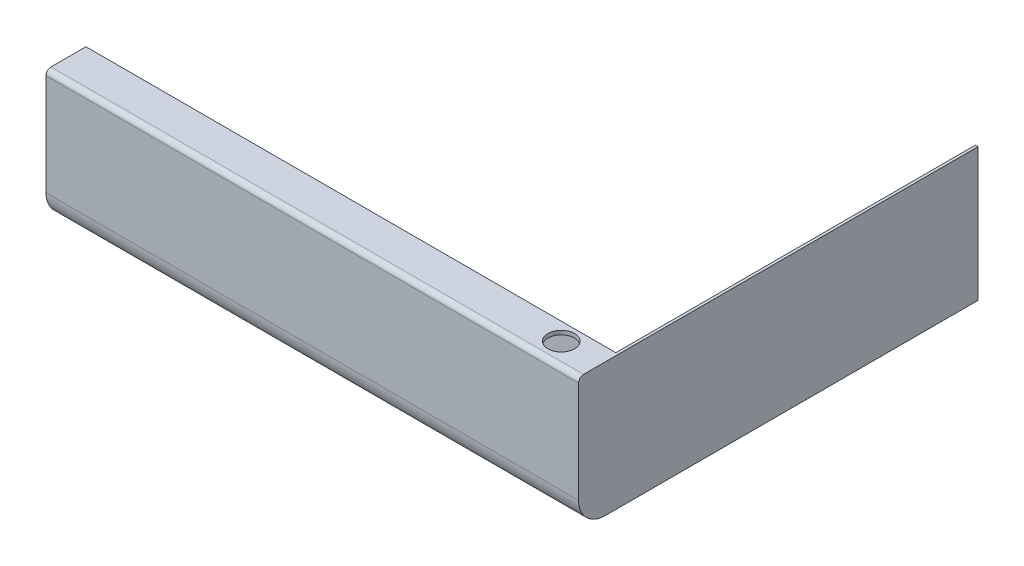
ISO-10303-21;
HEADER;
FILE_DESCRIPTION(('STEP AP214'),'2;1');
FILE_NAME('part.step','',(''),(''),'','','');
FILE_SCHEMA(('AUTOMOTIVE_DESIGN { 1 0 10303 214 1 1 1 1 }'));
ENDSEC;
DATA;
#1=APPLICATION_CONTEXT('core data for automotive mechanical design processes');
#2=APPLICATION_PROTOCOL_DEFINITION('international standard','automotive_design',2000,#1);
#3=PRODUCT_CONTEXT('',#1,'mechanical');
#4=PRODUCT('Part','Part','',(#3));
#5=PRODUCT_RELATED_PRODUCT_CATEGORY('part','',(#4));
#6=PRODUCT_DEFINITION_FORMATION('','',#4);
#7=PRODUCT_DEFINITION_CONTEXT('part definition',#1,'design');
#8=PRODUCT_DEFINITION('design','',#6,#7);
#9=PRODUCT_DEFINITION_SHAPE('','',#8);
#10=(LENGTH_UNIT() NAMED_UNIT(*) SI_UNIT(.MILLI.,.METRE.));
#11=(NAMED_UNIT(*) PLANE_ANGLE_UNIT() SI_UNIT($,.RADIAN.));
#12=(NAMED_UNIT(*) SI_UNIT($,.STERADIAN.) SOLID_ANGLE_UNIT());
#13=UNCERTAINTY_MEASURE_WITH_UNIT(LENGTH_MEASURE(1.E-05),#10,'distance_accuracy_value','');
#14=(GEOMETRIC_REPRESENTATION_CONTEXT(3) GLOBAL_UNCERTAINTY_ASSIGNED_CONTEXT((#13)) GLOBAL_UNIT_ASSIGNED_CONTEXT((#10,
#11,#12)) REPRESENTATION_CONTEXT('',''));
#15=CARTESIAN_POINT('',(0.,0.,0.));
#16=DIRECTION('',(0.,0.,1.));
#17=DIRECTION('',(1.,0.,0.));
#18=AXIS2_PLACEMENT_3D('',#15,#16,#17);
#19=CARTESIAN_POINT('',(0.,-47.,-5.99999999999983));
#20=DIRECTION('',(0.,-1.,0.));
#21=DIRECTION('',(0.,0.,1.));
#22=AXIS2_PLACEMENT_3D('',#19,#20,#21);
#23=PLANE('',#22);
#24=DIRECTION('',(0.,0.,-1.));
#25=VECTOR('',#24,1.);
#26=CARTESIAN_POINT('',(198.,-47.,-5.99999999999983));
#27=LINE('',#26,#25);
#28=CARTESIAN_POINT('',(198.,-47.0000000000001,-22.9999999999999));
#29=VERTEX_POINT('',#28);
#30=CARTESIAN_POINT('',(198.,-47.0000000000003,-99.2633999999996));
#31=VERTEX_POINT('',#30);
#32=EDGE_CURVE('E228',#29,#31,#27,.T.);
#33=ORIENTED_EDGE('',*,*,#32,.T.);
#34=DIRECTION('',(1.,0.,0.));
#35=VECTOR('',#34,1.);
#36=CARTESIAN_POINT('',(200.,-47.0000000000003,-99.2633999999996));
#37=LINE('',#36,#35);
#38=CARTESIAN_POINT('',(-198.,-47.0000000000003,-99.2633999999996));
#39=VERTEX_POINT('',#38);
#40=EDGE_CURVE('E284',#31,#39,#37,.F.);
#41=ORIENTED_EDGE('',*,*,#40,.T.);
#42=DIRECTION('',(0.,0.,1.));
#43=VECTOR('',#42,1.);
#44=CARTESIAN_POINT('',(-198.,-47.,-5.99999999999983));
#45=LINE('',#44,#43);
#46=CARTESIAN_POINT('',(-198.,-47.0000000000001,-22.9999999999999));
#47=VERTEX_POINT('',#46);
#48=EDGE_CURVE('E260',#39,#47,#45,.T.);
#49=ORIENTED_EDGE('',*,*,#48,.T.);
#50=DIRECTION('',(-1.,0.,0.));
#51=VECTOR('',#50,1.);
#52=CARTESIAN_POINT('',(-200.,-47.0000000000001,-22.9999999999999));
#53=LINE('',#52,#51);
#54=EDGE_CURVE('E338',#47,#29,#53,.F.);
#55=ORIENTED_EDGE('',*,*,#54,.T.);
#56=EDGE_LOOP('',(#33,#41,#49,#55));
#57=FACE_BOUND('',#56,.T.);
#58=ADVANCED_FACE('F39',(#57),#23,.F.);
#59=CARTESIAN_POINT('',(0.,0.,-6.));
#60=DIRECTION('',(0.,0.,-1.));
#61=DIRECTION('',(1.,0.,0.));
#62=AXIS2_PLACEMENT_3D('',#59,#60,#61);
#63=PLANE('',#62);
#64=DIRECTION('',(1.,0.,0.));
#65=VECTOR('',#64,1.);
#66=CARTESIAN_POINT('',(200.,-30.0000000000001,-6.));
#67=LINE('',#66,#65);
#68=CARTESIAN_POINT('',(198.,-30.0000000000001,-6.));
#69=VERTEX_POINT('',#68);
#70=CARTESIAN_POINT('',(-198.,-30.0000000000001,-6.));
#71=VERTEX_POINT('',#70);
#72=EDGE_CURVE('E345',#69,#71,#67,.F.);
#73=ORIENTED_EDGE('',*,*,#72,.T.);
#74=DIRECTION('',(0.,-1.,0.));
#75=VECTOR('',#74,1.);
#76=CARTESIAN_POINT('',(-198.,0.,-6.));
#77=LINE('',#76,#75);
#78=CARTESIAN_POINT('',(-198.,46.2634,-6.00000000000002));
#79=VERTEX_POINT('',#78);
#80=EDGE_CURVE('E265',#79,#71,#77,.T.);
#81=ORIENTED_EDGE('',*,*,#80,.F.);
#82=DIRECTION('',(-1.,0.,0.));
#83=VECTOR('',#82,1.);
#84=CARTESIAN_POINT('',(-200.,46.2634,-6.00000000000002));
#85=LINE('',#84,#83);
#86=CARTESIAN_POINT('',(198.,46.2634,-5.99999999999999));
#87=VERTEX_POINT('',#86);
#88=EDGE_CURVE('E314',#79,#87,#85,.F.);
#89=ORIENTED_EDGE('',*,*,#88,.T.);
#90=DIRECTION('',(0.,1.,0.));
#91=VECTOR('',#90,1.);
#92=CARTESIAN_POINT('',(198.,0.,-6.));
#93=LINE('',#92,#91);
#94=EDGE_CURVE('E232',#69,#87,#93,.T.);
#95=ORIENTED_EDGE('',*,*,#94,.F.);
#96=EDGE_LOOP('',(#73,#81,#89,#95));
#97=FACE_BOUND('',#96,.T.);
#98=ADVANCED_FACE('F405',(#97),#63,.T.);
#99=CARTESIAN_POINT('',(200.,-30.0000000000001,-23.));
#100=DIRECTION('',(1.,0.,0.));
#101=DIRECTION('',(0.,-1.,0.));
#102=AXIS2_PLACEMENT_3D('',#99,#100,#101);
#103=CYLINDRICAL_SURFACE('',#102,17.);
#104=CARTESIAN_POINT('',(198.,-30.0000000000001,-23.));
#105=DIRECTION('',(-1.,0.,0.));
#106=DIRECTION('',(0.,0.,1.));
#107=AXIS2_PLACEMENT_3D('',#104,#105,#106);
#108=CIRCLE('',#107,17.);
#109=EDGE_CURVE('E54',#69,#29,#108,.F.);
#110=ORIENTED_EDGE('',*,*,#109,.T.);
#111=ORIENTED_EDGE('',*,*,#54,.F.);
#112=CARTESIAN_POINT('',(-198.,-30.0000000000001,-23.));
#113=DIRECTION('',(1.,0.,0.));
#114=DIRECTION('',(0.,0.,-1.));
#115=AXIS2_PLACEMENT_3D('',#112,#113,#114);
#116=CIRCLE('',#115,17.);
#117=EDGE_CURVE('E263',#47,#71,#116,.F.);
#118=ORIENTED_EDGE('',*,*,#117,.T.);
#119=ORIENTED_EDGE('',*,*,#72,.F.);
#120=EDGE_LOOP('',(#110,#111,#118,#119));
#121=FACE_BOUND('',#120,.T.);
#122=ADVANCED_FACE('F408',(#121),#103,.F.);
#123=CARTESIAN_POINT('',(-200.,46.2634,-6.73660000000002));
#124=DIRECTION('',(-1.,0.,0.));
#125=DIRECTION('',(0.,1.,0.));
#126=AXIS2_PLACEMENT_3D('',#123,#124,#125);
#127=CYLINDRICAL_SURFACE('',#126,0.736599999999997);
#128=CARTESIAN_POINT('',(198.,46.2634,-6.73659999999999));
#129=DIRECTION('',(-1.,0.,0.));
#130=DIRECTION('',(0.,0.,1.));
#131=AXIS2_PLACEMENT_3D('',#128,#129,#130);
#132=CIRCLE('',#131,0.736599999999997);
#133=CARTESIAN_POINT('',(198.,47.,-6.7366));
#134=VERTEX_POINT('',#133);
#135=EDGE_CURVE('E234',#134,#87,#132,.F.);
#136=ORIENTED_EDGE('',*,*,#135,.T.);
#137=ORIENTED_EDGE('',*,*,#88,.F.);
#138=CARTESIAN_POINT('',(-198.,46.2634,-6.73660000000002));
#139=DIRECTION('',(1.,0.,0.));
#140=DIRECTION('',(0.,0.,-1.));
#141=AXIS2_PLACEMENT_3D('',#138,#139,#140);
#142=CIRCLE('',#141,0.736599999999997);
#143=CARTESIAN_POINT('',(-198.,47.,-6.73660000000001));
#144=VERTEX_POINT('',#143);
#145=EDGE_CURVE('E268',#79,#144,#142,.F.);
#146=ORIENTED_EDGE('',*,*,#145,.T.);
#147=DIRECTION('',(1.,0.,0.));
#148=VECTOR('',#147,1.);
#149=CARTESIAN_POINT('',(200.,47.,-6.7366));
#150=LINE('',#149,#148);
#151=EDGE_CURVE('E309',#134,#144,#150,.F.);
#152=ORIENTED_EDGE('',*,*,#151,.F.);
#153=EDGE_LOOP('',(#136,#137,#146,#152));
#154=FACE_BOUND('',#153,.T.);
#155=ADVANCED_FACE('F402',(#154),#127,.F.);
#156=CARTESIAN_POINT('',(200.,-46.2634000000003,-99.2633999999996));
#157=DIRECTION('',(1.,0.,0.));
#158=DIRECTION('',(0.,0.,-1.));
#159=AXIS2_PLACEMENT_3D('',#156,#157,#158);
#160=CYLINDRICAL_SURFACE('',#159,0.736600000000004);
#161=CARTESIAN_POINT('',(198.,-46.2634000000003,-99.2633999999996));
#162=DIRECTION('',(-1.,0.,0.));
#163=DIRECTION('',(0.,0.,1.));
#164=AXIS2_PLACEMENT_3D('',#161,#162,#163);
#165=CIRCLE('',#164,0.736600000000004);
#166=CARTESIAN_POINT('',(198.,-46.2634000000003,-99.9999999999997));
#167=VERTEX_POINT('',#166);
#168=EDGE_CURVE('E225',#31,#167,#165,.F.);
#169=ORIENTED_EDGE('',*,*,#168,.T.);
#170=DIRECTION('',(-1.,0.,0.));
#171=VECTOR('',#170,1.);
#172=CARTESIAN_POINT('',(-200.,-46.2634000000003,-99.9999999999997));
#173=LINE('',#172,#171);
#174=CARTESIAN_POINT('',(-198.,-46.2634000000003,-99.9999999999997));
#175=VERTEX_POINT('',#174);
#176=EDGE_CURVE('E300',#175,#167,#173,.F.);
#177=ORIENTED_EDGE('',*,*,#176,.F.);
#178=CARTESIAN_POINT('',(-198.,-46.2634000000003,-99.2633999999996));
#179=DIRECTION('',(1.,0.,0.));
#180=DIRECTION('',(0.,0.,-1.));
#181=AXIS2_PLACEMENT_3D('',#178,#179,#180);
#182=CIRCLE('',#181,0.736600000000004);
#183=EDGE_CURVE('E257',#175,#39,#182,.F.);
#184=ORIENTED_EDGE('',*,*,#183,.T.);
#185=ORIENTED_EDGE('',*,*,#40,.F.);
#186=EDGE_LOOP('',(#169,#177,#184,#185));
#187=FACE_BOUND('',#186,.T.);
#188=ADVANCED_FACE('F412',(#187),#160,.F.);
#189=CARTESIAN_POINT('',(0.,47.,-5.99999999999982));
#190=DIRECTION('',(0.,1.,0.));
#191=DIRECTION('',(0.,0.,-1.));
#192=AXIS2_PLACEMENT_3D('',#189,#190,#191);
#193=PLANE('',#192);
#194=CARTESIAN_POINT('',(170.,47.,-20.));
#195=DIRECTION('',(0.,-1.,0.));
#196=DIRECTION('',(0.,0.,-1.));
#197=AXIS2_PLACEMENT_3D('',#194,#195,#196);
#198=CIRCLE('',#197,9.99999999999998);
#199=CARTESIAN_POINT('',(170.,47.0000000000001,-30.));
#200=VERTEX_POINT('',#199);
#201=EDGE_CURVE('E281',#200,#200,#198,.T.);
#202=ORIENTED_EDGE('',*,*,#201,.F.);
#203=EDGE_LOOP('',(#202));
#204=FACE_BOUND('',#203,.T.);
#205=DIRECTION('',(0.,0.,1.));
#206=VECTOR('',#205,1.);
#207=CARTESIAN_POINT('',(198.,47.,-5.99999999999982));
#208=LINE('',#207,#206);
#209=CARTESIAN_POINT('',(198.,47.0000000000001,-33.));
#210=VERTEX_POINT('',#209);
#211=EDGE_CURVE('E236',#210,#134,#208,.T.);
#212=ORIENTED_EDGE('',*,*,#211,.T.);
#213=ORIENTED_EDGE('',*,*,#151,.T.);
#214=DIRECTION('',(0.,0.,-1.));
#215=VECTOR('',#214,1.);
#216=CARTESIAN_POINT('',(-198.,47.,-5.99999999999982));
#217=LINE('',#216,#215);
#218=CARTESIAN_POINT('',(-198.,47.,-18.));
#219=VERTEX_POINT('',#218);
#220=EDGE_CURVE('E271',#144,#219,#217,.T.);
#221=ORIENTED_EDGE('',*,*,#220,.T.);
#222=DIRECTION('',(1.,0.,0.));
#223=VECTOR('',#222,1.);
#224=CARTESIAN_POINT('',(0.,47.,-18.));
#225=LINE('',#224,#223);
#226=CARTESIAN_POINT('',(-200.,47.,-18.));
#227=VERTEX_POINT('',#226);
#228=EDGE_CURVE('E47',#227,#219,#225,.T.);
#229=ORIENTED_EDGE('',*,*,#228,.F.);
#230=DIRECTION('',(0.,0.,-1.));
#231=VECTOR('',#230,1.);
#232=CARTESIAN_POINT('',(-200.,47.,-5.99999999999982));
#233=LINE('',#232,#231);
#234=CARTESIAN_POINT('',(-200.,47.0000000000001,-33.));
#235=VERTEX_POINT('',#234);
#236=EDGE_CURVE('E321',#235,#227,#233,.F.);
#237=ORIENTED_EDGE('',*,*,#236,.F.);
#238=DIRECTION('',(1.,0.,0.));
#239=VECTOR('',#238,1.);
#240=CARTESIAN_POINT('',(0.,47.0000000000001,-33.));
#241=LINE('',#240,#239);
#242=EDGE_CURVE('E324',#210,#235,#241,.F.);
#243=ORIENTED_EDGE('',*,*,#242,.F.);
#244=EDGE_LOOP('',(#212,#213,#221,#229,#237,#243));
#245=FACE_BOUND('',#244,.T.);
#246=ADVANCED_FACE('F383',(#204,#245),#193,.F.);
#247=CARTESIAN_POINT('',(-200.,50.0000000000001,-33.));
#248=DIRECTION('',(0.,0.,-1.));
#249=DIRECTION('',(0.,-1.,0.));
#250=AXIS2_PLACEMENT_3D('',#247,#248,#249);
#251=PLANE('',#250);
#252=ORIENTED_EDGE('',*,*,#242,.T.);
#253=DIRECTION('',(0.,-1.,0.));
#254=VECTOR('',#253,1.);
#255=CARTESIAN_POINT('',(-200.,50.0000000000001,-33.));
#256=LINE('',#255,#254);
#257=CARTESIAN_POINT('',(-200.,50.0000000000001,-33.));
#258=VERTEX_POINT('',#257);
#259=EDGE_CURVE('E312',#258,#235,#256,.T.);
#260=ORIENTED_EDGE('',*,*,#259,.F.);
#261=DIRECTION('',(-1.,0.,0.));
#262=VECTOR('',#261,1.);
#263=CARTESIAN_POINT('',(-200.,50.0000000000001,-33.));
#264=LINE('',#263,#262);
#265=CARTESIAN_POINT('',(198.,50.0000000000001,-33.));
#266=VERTEX_POINT('',#265);
#267=EDGE_CURVE('E318',#266,#258,#264,.T.);
#268=ORIENTED_EDGE('',*,*,#267,.F.);
#269=DIRECTION('',(0.,1.,0.));
#270=VECTOR('',#269,1.);
#271=CARTESIAN_POINT('',(198.,50.0000000000001,-33.));
#272=LINE('',#271,#270);
#273=EDGE_CURVE('E201',#210,#266,#272,.T.);
#274=ORIENTED_EDGE('',*,*,#273,.F.);
#275=EDGE_LOOP('',(#252,#260,#268,#274));
#276=FACE_BOUND('',#275,.T.);
#277=ADVANCED_FACE('F447',(#276),#251,.T.);
#278=CARTESIAN_POINT('',(200.,-46.2634000000003,-99.2633999999996));
#279=DIRECTION('',(1.,0.,0.));
#280=DIRECTION('',(0.,0.,-1.));
#281=AXIS2_PLACEMENT_3D('',#278,#279,#280);
#282=CYLINDRICAL_SURFACE('',#281,3.7366);
#283=DIRECTION('',(1.,0.,0.));
#284=VECTOR('',#283,1.);
#285=CARTESIAN_POINT('',(200.,-50.0000000000003,-99.2633999999996));
#286=LINE('',#285,#284);
#287=CARTESIAN_POINT('',(198.,-50.0000000000003,-99.2633999999996));
#288=VERTEX_POINT('',#287);
#289=CARTESIAN_POINT('',(-200.,-50.0000000000003,-99.2633999999996));
#290=VERTEX_POINT('',#289);
#291=EDGE_CURVE('E303',#288,#290,#286,.F.);
#292=ORIENTED_EDGE('',*,*,#291,.T.);
#293=CARTESIAN_POINT('',(-200.,-46.2634000000003,-99.2633999999996));
#294=DIRECTION('',(-1.,0.,0.));
#295=DIRECTION('',(0.,0.,1.));
#296=AXIS2_PLACEMENT_3D('',#293,#294,#295);
#297=CIRCLE('',#296,3.7366);
#298=CARTESIAN_POINT('',(-200.,-46.2634000000004,-103.));
#299=VERTEX_POINT('',#298);
#300=EDGE_CURVE('E306',#290,#299,#297,.F.);
#301=ORIENTED_EDGE('',*,*,#300,.T.);
#302=DIRECTION('',(1.,0.,0.));
#303=VECTOR('',#302,1.);
#304=CARTESIAN_POINT('',(0.,-46.2634000000003,-103.));
#305=LINE('',#304,#303);
#306=CARTESIAN_POINT('',(198.,-46.2634000000003,-103.));
#307=VERTEX_POINT('',#306);
#308=EDGE_CURVE('E297',#299,#307,#305,.T.);
#309=ORIENTED_EDGE('',*,*,#308,.T.);
#310=CARTESIAN_POINT('',(198.,-46.2634000000003,-99.2633999999996));
#311=DIRECTION('',(-1.,0.,0.));
#312=DIRECTION('',(0.,0.,1.));
#313=AXIS2_PLACEMENT_3D('',#310,#311,#312);
#314=CIRCLE('',#313,3.7366);
#315=EDGE_CURVE('E222',#288,#307,#314,.F.);
#316=ORIENTED_EDGE('',*,*,#315,.F.);
#317=EDGE_LOOP('',(#292,#301,#309,#316));
#318=FACE_BOUND('',#317,.T.);
#319=ADVANCED_FACE('F433',(#318),#282,.T.);
#320=CARTESIAN_POINT('',(0.,-7.08475771535493E-13,-103.));
#321=DIRECTION('',(0.,0.,-1.));
#322=DIRECTION('',(0.,-1.,0.));
#323=AXIS2_PLACEMENT_3D('',#320,#321,#322);
#324=PLANE('',#323);
#325=CARTESIAN_POINT('',(170.,-33.0000000000003,-103.));
#326=DIRECTION('',(0.,0.,1.));
#327=DIRECTION('',(1.,0.,0.));
#328=AXIS2_PLACEMENT_3D('',#325,#326,#327);
#329=CIRCLE('',#328,9.99999999999998);
#330=CARTESIAN_POINT('',(180.,-33.0000000000003,-103.));
#331=VERTEX_POINT('',#330);
#332=EDGE_CURVE('E274',#331,#331,#329,.T.);
#333=ORIENTED_EDGE('',*,*,#332,.T.);
#334=EDGE_LOOP('',(#333));
#335=FACE_BOUND('',#334,.T.);
#336=ORIENTED_EDGE('',*,*,#308,.F.);
#337=DIRECTION('',(0.,1.,0.));
#338=VECTOR('',#337,1.);
#339=CARTESIAN_POINT('',(-200.,-20.0000000000003,-103.));
#340=LINE('',#339,#338);
#341=CARTESIAN_POINT('',(-200.,-20.0000000000003,-103.));
#342=VERTEX_POINT('',#341);
#343=EDGE_CURVE('E288',#299,#342,#340,.T.);
#344=ORIENTED_EDGE('',*,*,#343,.T.);
#345=DIRECTION('',(1.,0.,0.));
#346=VECTOR('',#345,1.);
#347=CARTESIAN_POINT('',(200.,-20.0000000000003,-103.));
#348=LINE('',#347,#346);
#349=CARTESIAN_POINT('',(198.,-20.0000000000003,-103.));
#350=VERTEX_POINT('',#349);
#351=EDGE_CURVE('E285',#342,#350,#348,.T.);
#352=ORIENTED_EDGE('',*,*,#351,.T.);
#353=DIRECTION('',(0.,1.,0.));
#354=VECTOR('',#353,1.);
#355=CARTESIAN_POINT('',(198.,-7.08475771535493E-13,-103.));
#356=LINE('',#355,#354);
#357=EDGE_CURVE('E219',#307,#350,#356,.T.);
#358=ORIENTED_EDGE('',*,*,#357,.F.);
#359=EDGE_LOOP('',(#336,#344,#352,#358));
#360=FACE_BOUND('',#359,.T.);
#361=ADVANCED_FACE('F426',(#335,#360),#324,.T.);
#362=CARTESIAN_POINT('',(0.,-6.87485684180053E-13,-100.));
#363=DIRECTION('',(0.,0.,-1.));
#364=DIRECTION('',(0.,-1.,0.));
#365=AXIS2_PLACEMENT_3D('',#362,#363,#364);
#366=PLANE('',#365);
#367=CARTESIAN_POINT('',(170.,-33.0000000000003,-99.9999999999998));
#368=DIRECTION('',(0.,0.,1.));
#369=DIRECTION('',(0.,-1.,0.));
#370=AXIS2_PLACEMENT_3D('',#367,#368,#369);
#371=CIRCLE('',#370,9.99999999999998);
#372=CARTESIAN_POINT('',(170.,-43.0000000000003,-99.9999999999997));
#373=VERTEX_POINT('',#372);
#374=EDGE_CURVE('E277',#373,#373,#371,.T.);
#375=ORIENTED_EDGE('',*,*,#374,.F.);
#376=EDGE_LOOP('',(#375));
#377=FACE_BOUND('',#376,.T.);
#378=DIRECTION('',(0.,1.,0.));
#379=VECTOR('',#378,1.);
#380=CARTESIAN_POINT('',(198.,-6.87485684180053E-13,-100.));
#381=LINE('',#380,#379);
#382=CARTESIAN_POINT('',(198.,-20.0000000000003,-99.9999999999999));
#383=VERTEX_POINT('',#382);
#384=EDGE_CURVE('E213',#167,#383,#381,.T.);
#385=ORIENTED_EDGE('',*,*,#384,.T.);
#386=DIRECTION('',(-1.,0.,0.));
#387=VECTOR('',#386,1.);
#388=CARTESIAN_POINT('',(0.,-20.0000000000003,-99.9999999999999));
#389=LINE('',#388,#387);
#390=CARTESIAN_POINT('',(-200.,-20.0000000000003,-99.9999999999999));
#391=VERTEX_POINT('',#390);
#392=EDGE_CURVE('E291',#391,#383,#389,.F.);
#393=ORIENTED_EDGE('',*,*,#392,.F.);
#394=DIRECTION('',(0.,-1.,0.));
#395=VECTOR('',#394,1.);
#396=CARTESIAN_POINT('',(-200.,-6.87485684180053E-13,-100.));
#397=LINE('',#396,#395);
#398=CARTESIAN_POINT('',(-200.,-35.0000000000001,-99.9999999999998));
#399=VERTEX_POINT('',#398);
#400=EDGE_CURVE('E294',#399,#391,#397,.F.);
#401=ORIENTED_EDGE('',*,*,#400,.F.);
#402=DIRECTION('',(-1.,0.,0.));
#403=VECTOR('',#402,1.);
#404=CARTESIAN_POINT('',(0.,-35.0000000000001,-99.9999999999997));
#405=LINE('',#404,#403);
#406=CARTESIAN_POINT('',(-198.,-35.,-99.9999999999997));
#407=VERTEX_POINT('',#406);
#408=EDGE_CURVE('E373',#407,#399,#405,.T.);
#409=ORIENTED_EDGE('',*,*,#408,.F.);
#410=DIRECTION('',(0.,-1.,0.));
#411=VECTOR('',#410,1.);
#412=CARTESIAN_POINT('',(-198.,-6.87485684180053E-13,-100.));
#413=LINE('',#412,#411);
#414=EDGE_CURVE('E367',#407,#175,#413,.T.);
#415=ORIENTED_EDGE('',*,*,#414,.T.);
#416=ORIENTED_EDGE('',*,*,#176,.T.);
#417=EDGE_LOOP('',(#385,#393,#401,#409,#415,#416));
#418=FACE_BOUND('',#417,.T.);
#419=ADVANCED_FACE('F417',(#377,#418),#366,.F.);
#420=CARTESIAN_POINT('',(200.,-20.0000000000003,-103.));
#421=DIRECTION('',(0.,1.,0.));
#422=DIRECTION('',(0.,0.,-1.));
#423=AXIS2_PLACEMENT_3D('',#420,#421,#422);
#424=PLANE('',#423);
#425=ORIENTED_EDGE('',*,*,#351,.F.);
#426=DIRECTION('',(0.,0.,1.));
#427=VECTOR('',#426,1.);
#428=CARTESIAN_POINT('',(-200.,-20.0000000000003,-103.));
#429=LINE('',#428,#427);
#430=EDGE_CURVE('E282',#342,#391,#429,.T.);
#431=ORIENTED_EDGE('',*,*,#430,.T.);
#432=ORIENTED_EDGE('',*,*,#392,.T.);
#433=DIRECTION('',(0.,0.,1.));
#434=VECTOR('',#433,1.);
#435=CARTESIAN_POINT('',(198.,-20.0000000000003,-103.));
#436=LINE('',#435,#434);
#437=EDGE_CURVE('E11',#350,#383,#436,.T.);
#438=ORIENTED_EDGE('',*,*,#437,.F.);
#439=EDGE_LOOP('',(#425,#431,#432,#438));
#440=FACE_BOUND('',#439,.T.);
#441=ADVANCED_FACE('F423',(#440),#424,.T.);
#442=CARTESIAN_POINT('',(0.,-50.,-5.99999999999981));
#443=DIRECTION('',(0.,-1.,0.));
#444=DIRECTION('',(0.,0.,1.));
#445=AXIS2_PLACEMENT_3D('',#442,#443,#444);
#446=PLANE('',#445);
#447=DIRECTION('',(0.,0.,1.));
#448=VECTOR('',#447,1.);
#449=CARTESIAN_POINT('',(198.,-50.0000000000001,-303.));
#450=LINE('',#449,#448);
#451=CARTESIAN_POINT('',(198.,-50.0000000000001,-303.));
#452=VERTEX_POINT('',#451);
#453=EDGE_CURVE('E205',#452,#288,#450,.T.);
#454=ORIENTED_EDGE('',*,*,#453,.F.);
#455=DIRECTION('',(1.,0.,0.));
#456=VECTOR('',#455,1.);
#457=CARTESIAN_POINT('',(198.,-50.0000000000001,-303.));
#458=LINE('',#457,#456);
#459=CARTESIAN_POINT('',(200.,-50.0000000000001,-303.));
#460=VERTEX_POINT('',#459);
#461=EDGE_CURVE('E194',#452,#460,#458,.T.);
#462=ORIENTED_EDGE('',*,*,#461,.T.);
#463=DIRECTION('',(0.,0.,1.));
#464=VECTOR('',#463,1.);
#465=CARTESIAN_POINT('',(200.,-50.,-5.99999999999999));
#466=LINE('',#465,#464);
#467=CARTESIAN_POINT('',(200.,-50.0000000000001,-22.9999999999999));
#468=VERTEX_POINT('',#467);
#469=EDGE_CURVE('E342',#460,#468,#466,.T.);
#470=ORIENTED_EDGE('',*,*,#469,.T.);
#471=DIRECTION('',(1.,0.,0.));
#472=VECTOR('',#471,1.);
#473=CARTESIAN_POINT('',(0.,-50.0000000000001,-22.9999999999999));
#474=LINE('',#473,#472);
#475=CARTESIAN_POINT('',(-200.,-50.0000000000001,-22.9999999999999));
#476=VERTEX_POINT('',#475);
#477=EDGE_CURVE('E348',#476,#468,#474,.T.);
#478=ORIENTED_EDGE('',*,*,#477,.F.);
#479=DIRECTION('',(0.,0.,-1.));
#480=VECTOR('',#479,1.);
#481=CARTESIAN_POINT('',(-200.,-50.0000000000003,-103.));
#482=LINE('',#481,#480);
#483=EDGE_CURVE('E346',#476,#290,#482,.T.);
#484=ORIENTED_EDGE('',*,*,#483,.T.);
#485=ORIENTED_EDGE('',*,*,#291,.F.);
#486=EDGE_LOOP('',(#454,#462,#470,#478,#484,#485));
#487=FACE_BOUND('',#486,.T.);
#488=ADVANCED_FACE('F435',(#487),#446,.T.);
#489=CARTESIAN_POINT('',(0.,0.,-3.));
#490=DIRECTION('',(0.,0.,-1.));
#491=DIRECTION('',(1.,0.,0.));
#492=AXIS2_PLACEMENT_3D('',#489,#490,#491);
#493=PLANE('',#492);
#494=DIRECTION('',(1.,0.,0.));
#495=VECTOR('',#494,1.);
#496=CARTESIAN_POINT('',(200.,-30.0000000000001,-3.));
#497=LINE('',#496,#495);
#498=CARTESIAN_POINT('',(200.,-30.0000000000001,-3.));
#499=VERTEX_POINT('',#498);
#500=CARTESIAN_POINT('',(-200.,-30.,-3.));
#501=VERTEX_POINT('',#500);
#502=EDGE_CURVE('E352',#499,#501,#497,.F.);
#503=ORIENTED_EDGE('',*,*,#502,.F.);
#504=DIRECTION('',(0.,1.,0.));
#505=VECTOR('',#504,1.);
#506=CARTESIAN_POINT('',(200.,50.,-3.));
#507=LINE('',#506,#505);
#508=CARTESIAN_POINT('',(200.,46.2634,-3.));
#509=VERTEX_POINT('',#508);
#510=EDGE_CURVE('E358',#499,#509,#507,.T.);
#511=ORIENTED_EDGE('',*,*,#510,.T.);
#512=DIRECTION('',(-1.,0.,0.));
#513=VECTOR('',#512,1.);
#514=CARTESIAN_POINT('',(-200.,46.2634,-3.00000000000002));
#515=LINE('',#514,#513);
#516=CARTESIAN_POINT('',(-200.,46.2634,-3.00000000000002));
#517=VERTEX_POINT('',#516);
#518=EDGE_CURVE('E331',#517,#509,#515,.F.);
#519=ORIENTED_EDGE('',*,*,#518,.F.);
#520=DIRECTION('',(0.,-1.,0.));
#521=VECTOR('',#520,1.);
#522=CARTESIAN_POINT('',(-200.,50.,-3.));
#523=LINE('',#522,#521);
#524=EDGE_CURVE('E364',#517,#501,#523,.T.);
#525=ORIENTED_EDGE('',*,*,#524,.T.);
#526=EDGE_LOOP('',(#503,#511,#519,#525));
#527=FACE_BOUND('',#526,.T.);
#528=ADVANCED_FACE('F444',(#527),#493,.F.);
#529=CARTESIAN_POINT('',(200.,50.,-3.));
#530=DIRECTION('',(1.,0.,0.));
#531=DIRECTION('',(0.,0.,1.));
#532=AXIS2_PLACEMENT_3D('',#529,#530,#531);
#533=PLANE('',#532);
#534=CARTESIAN_POINT('',(200.,-30.0000000000001,-23.));
#535=DIRECTION('',(-1.,0.,0.));
#536=DIRECTION('',(0.,0.,1.));
#537=AXIS2_PLACEMENT_3D('',#534,#535,#536);
#538=CIRCLE('',#537,20.);
#539=EDGE_CURVE('E356',#468,#499,#538,.T.);
#540=ORIENTED_EDGE('',*,*,#539,.F.);
#541=ORIENTED_EDGE('',*,*,#469,.F.);
#542=DIRECTION('',(0.,-1.,0.));
#543=VECTOR('',#542,1.);
#544=CARTESIAN_POINT('',(200.,50.,-303.));
#545=LINE('',#544,#543);
#546=CARTESIAN_POINT('',(200.,50.,-303.));
#547=VERTEX_POINT('',#546);
#548=EDGE_CURVE('E766',#547,#460,#545,.T.);
#549=ORIENTED_EDGE('',*,*,#548,.F.);
#550=DIRECTION('',(0.,0.,-1.));
#551=VECTOR('',#550,1.);
#552=CARTESIAN_POINT('',(200.,50.0000000000001,-33.));
#553=LINE('',#552,#551);
#554=CARTESIAN_POINT('',(200.,50.,-6.73659999999998));
#555=VERTEX_POINT('',#554);
#556=EDGE_CURVE('E210',#555,#547,#553,.T.);
#557=ORIENTED_EDGE('',*,*,#556,.F.);
#558=CARTESIAN_POINT('',(200.,46.2634,-6.73659999999999));
#559=DIRECTION('',(1.,0.,0.));
#560=DIRECTION('',(0.,0.,-1.));
#561=AXIS2_PLACEMENT_3D('',#558,#559,#560);
#562=CIRCLE('',#561,3.7366);
#563=EDGE_CURVE('E334',#509,#555,#562,.F.);
#564=ORIENTED_EDGE('',*,*,#563,.F.);
#565=ORIENTED_EDGE('',*,*,#510,.F.);
#566=EDGE_LOOP('',(#540,#541,#549,#557,#564,#565));
#567=FACE_BOUND('',#566,.T.);
#568=ADVANCED_FACE('F41',(#567),#533,.T.);
#569=CARTESIAN_POINT('',(-200.,-30.0000000000001,-23.));
#570=DIRECTION('',(-1.,0.,0.));
#571=DIRECTION('',(0.,0.,-1.));
#572=AXIS2_PLACEMENT_3D('',#569,#570,#571);
#573=PLANE('',#572);
#574=ORIENTED_EDGE('',*,*,#524,.F.);
#575=CARTESIAN_POINT('',(-200.,46.2634,-6.73660000000002));
#576=DIRECTION('',(1.,0.,0.));
#577=DIRECTION('',(0.,0.,-1.));
#578=AXIS2_PLACEMENT_3D('',#575,#576,#577);
#579=CIRCLE('',#578,3.7366);
#580=CARTESIAN_POINT('',(-200.,50.,-6.7366));
#581=VERTEX_POINT('',#580);
#582=EDGE_CURVE('E335',#581,#517,#579,.T.);
#583=ORIENTED_EDGE('',*,*,#582,.F.);
#584=DIRECTION('',(0.,0.,1.));
#585=VECTOR('',#584,1.);
#586=CARTESIAN_POINT('',(-200.,50.,-5.99999999999999));
#587=LINE('',#586,#585);
#588=EDGE_CURVE('E315',#258,#581,#587,.T.);
#589=ORIENTED_EDGE('',*,*,#588,.F.);
#590=ORIENTED_EDGE('',*,*,#259,.T.);
#591=ORIENTED_EDGE('',*,*,#236,.T.);
#592=DIRECTION('',(0.,1.,0.));
#593=VECTOR('',#592,1.);
#594=CARTESIAN_POINT('',(-200.,50.0000000000001,-18.));
#595=LINE('',#594,#593);
#596=CARTESIAN_POINT('',(-200.,-30.0000000000001,-18.));
#597=VERTEX_POINT('',#596);
#598=EDGE_CURVE('E244',#597,#227,#595,.T.);
#599=ORIENTED_EDGE('',*,*,#598,.F.);
#600=CARTESIAN_POINT('',(-200.,-30.0000000000001,-23.));
#601=DIRECTION('',(-1.,0.,0.));
#602=DIRECTION('',(0.,0.,-1.));
#603=AXIS2_PLACEMENT_3D('',#600,#601,#602);
#604=CIRCLE('',#603,4.99999999999998);
#605=CARTESIAN_POINT('',(-200.,-35.,-23.));
#606=VERTEX_POINT('',#605);
#607=EDGE_CURVE('E251',#606,#597,#604,.T.);
#608=ORIENTED_EDGE('',*,*,#607,.F.);
#609=DIRECTION('',(0.,0.,1.));
#610=VECTOR('',#609,1.);
#611=CARTESIAN_POINT('',(-200.,-35.0000000000001,-23.));
#612=LINE('',#611,#610);
#613=EDGE_CURVE('E239',#399,#606,#612,.T.);
#614=ORIENTED_EDGE('',*,*,#613,.F.);
#615=ORIENTED_EDGE('',*,*,#400,.T.);
#616=ORIENTED_EDGE('',*,*,#430,.F.);
#617=ORIENTED_EDGE('',*,*,#343,.F.);
#618=ORIENTED_EDGE('',*,*,#300,.F.);
#619=ORIENTED_EDGE('',*,*,#483,.F.);
#620=CARTESIAN_POINT('',(-200.,-30.0000000000001,-23.));
#621=DIRECTION('',(-1.,0.,0.));
#622=DIRECTION('',(0.,0.,1.));
#623=AXIS2_PLACEMENT_3D('',#620,#621,#622);
#624=CIRCLE('',#623,20.);
#625=EDGE_CURVE('E355',#501,#476,#624,.F.);
#626=ORIENTED_EDGE('',*,*,#625,.F.);
#627=EDGE_LOOP('',(#574,#583,#589,#590,#591,#599,#608,#614,#615,#616,#617,#618,#619,#626));
#628=FACE_BOUND('',#627,.T.);
#629=ADVANCED_FACE('F396',(#628),#573,.T.);
#630=CARTESIAN_POINT('',(200.,-30.0000000000001,-23.));
#631=DIRECTION('',(1.,0.,0.));
#632=DIRECTION('',(0.,-1.,0.));
#633=AXIS2_PLACEMENT_3D('',#630,#631,#632);
#634=CYLINDRICAL_SURFACE('',#633,20.);
#635=ORIENTED_EDGE('',*,*,#539,.T.);
#636=ORIENTED_EDGE('',*,*,#502,.T.);
#637=ORIENTED_EDGE('',*,*,#625,.T.);
#638=ORIENTED_EDGE('',*,*,#477,.T.);
#639=EDGE_LOOP('',(#635,#636,#637,#638));
#640=FACE_BOUND('',#639,.T.);
#641=ADVANCED_FACE('F438',(#640),#634,.T.);
#642=CARTESIAN_POINT('',(-200.,46.2634,-6.73660000000002));
#643=DIRECTION('',(-1.,0.,0.));
#644=DIRECTION('',(0.,1.,0.));
#645=AXIS2_PLACEMENT_3D('',#642,#643,#644);
#646=CYLINDRICAL_SURFACE('',#645,3.7366);
#647=ORIENTED_EDGE('',*,*,#563,.T.);
#648=DIRECTION('',(-1.,0.,0.));
#649=VECTOR('',#648,1.);
#650=CARTESIAN_POINT('',(0.,50.,-6.73659999999999));
#651=LINE('',#650,#649);
#652=EDGE_CURVE('E327',#555,#581,#651,.T.);
#653=ORIENTED_EDGE('',*,*,#652,.T.);
#654=ORIENTED_EDGE('',*,*,#582,.T.);
#655=ORIENTED_EDGE('',*,*,#518,.T.);
#656=EDGE_LOOP('',(#647,#653,#654,#655));
#657=FACE_BOUND('',#656,.T.);
#658=ADVANCED_FACE('F446',(#657),#646,.T.);
#659=CARTESIAN_POINT('',(0.,50.,-5.99999999999981));
#660=DIRECTION('',(0.,1.,0.));
#661=DIRECTION('',(0.,0.,-1.));
#662=AXIS2_PLACEMENT_3D('',#659,#660,#661);
#663=PLANE('',#662);
#664=ORIENTED_EDGE('',*,*,#652,.F.);
#665=ORIENTED_EDGE('',*,*,#556,.T.);
#666=DIRECTION('',(1.,0.,0.));
#667=VECTOR('',#666,1.);
#668=CARTESIAN_POINT('',(198.,50.,-303.));
#669=LINE('',#668,#667);
#670=CARTESIAN_POINT('',(198.,50.,-303.));
#671=VERTEX_POINT('',#670);
#672=EDGE_CURVE('E191',#671,#547,#669,.T.);
#673=ORIENTED_EDGE('',*,*,#672,.F.);
#674=DIRECTION('',(0.,0.,-1.));
#675=VECTOR('',#674,1.);
#676=CARTESIAN_POINT('',(198.,50.,-6.73659999999998));
#677=LINE('',#676,#675);
#678=EDGE_CURVE('E196',#266,#671,#677,.T.);
#679=ORIENTED_EDGE('',*,*,#678,.F.);
#680=ORIENTED_EDGE('',*,*,#267,.T.);
#681=ORIENTED_EDGE('',*,*,#588,.T.);
#682=EDGE_LOOP('',(#664,#665,#673,#679,#680,#681));
#683=FACE_BOUND('',#682,.T.);
#684=CARTESIAN_POINT('',(170.,50.,-20.));
#685=DIRECTION('',(0.,-1.,0.));
#686=DIRECTION('',(0.,0.,-1.));
#687=AXIS2_PLACEMENT_3D('',#684,#685,#686);
#688=CIRCLE('',#687,9.99999999999998);
#689=CARTESIAN_POINT('',(170.,50.0000000000001,-30.));
#690=VERTEX_POINT('',#689);
#691=EDGE_CURVE('E278',#690,#690,#688,.T.);
#692=ORIENTED_EDGE('',*,*,#691,.T.);
#693=EDGE_LOOP('',(#692));
#694=FACE_BOUND('',#693,.T.);
#695=ADVANCED_FACE('F207',(#683,#694),#663,.T.);
#696=CARTESIAN_POINT('',(170.,40.,-20.));
#697=DIRECTION('',(0.,1.,0.));
#698=DIRECTION('',(0.,0.,-1.));
#699=AXIS2_PLACEMENT_3D('',#696,#697,#698);
#700=CYLINDRICAL_SURFACE('',#699,9.99999999999998);
#701=ORIENTED_EDGE('',*,*,#691,.F.);
#702=EDGE_LOOP('',(#701));
#703=FACE_BOUND('',#702,.T.);
#704=ORIENTED_EDGE('',*,*,#201,.T.);
#705=EDGE_LOOP('',(#704));
#706=FACE_BOUND('',#705,.T.);
#707=ADVANCED_FACE('F492',(#703,#706),#700,.F.);
#708=CARTESIAN_POINT('',(170.,-33.0000000000003,-93.));
#709=DIRECTION('',(0.,0.,-1.));
#710=DIRECTION('',(1.,0.,0.));
#711=AXIS2_PLACEMENT_3D('',#708,#709,#710);
#712=CYLINDRICAL_SURFACE('',#711,9.99999999999998);
#713=ORIENTED_EDGE('',*,*,#332,.F.);
#714=EDGE_LOOP('',(#713));
#715=FACE_BOUND('',#714,.T.);
#716=ORIENTED_EDGE('',*,*,#374,.T.);
#717=EDGE_LOOP('',(#716));
#718=FACE_BOUND('',#717,.T.);
#719=ADVANCED_FACE('F497',(#715,#718),#712,.F.);
#720=CARTESIAN_POINT('',(-198.,50.0000000000001,-18.));
#721=DIRECTION('',(0.,0.,-1.));
#722=DIRECTION('',(0.,-1.,0.));
#723=AXIS2_PLACEMENT_3D('',#720,#721,#722);
#724=PLANE('',#723);
#725=ORIENTED_EDGE('',*,*,#228,.T.);
#726=DIRECTION('',(0.,1.,0.));
#727=VECTOR('',#726,1.);
#728=CARTESIAN_POINT('',(-198.,50.0000000000001,-18.));
#729=LINE('',#728,#727);
#730=CARTESIAN_POINT('',(-198.,-30.0000000000001,-18.));
#731=VERTEX_POINT('',#730);
#732=EDGE_CURVE('E246',#731,#219,#729,.T.);
#733=ORIENTED_EDGE('',*,*,#732,.F.);
#734=DIRECTION('',(-1.,0.,0.));
#735=VECTOR('',#734,1.);
#736=CARTESIAN_POINT('',(-198.,-30.0000000000001,-18.));
#737=LINE('',#736,#735);
#738=EDGE_CURVE('E255',#731,#597,#737,.T.);
#739=ORIENTED_EDGE('',*,*,#738,.T.);
#740=ORIENTED_EDGE('',*,*,#598,.T.);
#741=EDGE_LOOP('',(#725,#733,#739,#740));
#742=FACE_BOUND('',#741,.T.);
#743=ADVANCED_FACE('F379',(#742),#724,.T.);
#744=CARTESIAN_POINT('',(-198.,-35.0000000000001,-23.));
#745=DIRECTION('',(0.,1.,0.));
#746=DIRECTION('',(0.,0.,-1.));
#747=AXIS2_PLACEMENT_3D('',#744,#745,#746);
#748=PLANE('',#747);
#749=ORIENTED_EDGE('',*,*,#408,.T.);
#750=ORIENTED_EDGE('',*,*,#613,.T.);
#751=DIRECTION('',(-1.,0.,0.));
#752=VECTOR('',#751,1.);
#753=CARTESIAN_POINT('',(-198.,-35.,-23.));
#754=LINE('',#753,#752);
#755=CARTESIAN_POINT('',(-198.,-35.,-23.));
#756=VERTEX_POINT('',#755);
#757=EDGE_CURVE('E248',#756,#606,#754,.T.);
#758=ORIENTED_EDGE('',*,*,#757,.F.);
#759=DIRECTION('',(0.,0.,1.));
#760=VECTOR('',#759,1.);
#761=CARTESIAN_POINT('',(-198.,-35.0000000000001,-23.));
#762=LINE('',#761,#760);
#763=EDGE_CURVE('E240',#407,#756,#762,.T.);
#764=ORIENTED_EDGE('',*,*,#763,.F.);
#765=EDGE_LOOP('',(#749,#750,#758,#764));
#766=FACE_BOUND('',#765,.T.);
#767=ADVANCED_FACE('F420',(#766),#748,.T.);
#768=CARTESIAN_POINT('',(-198.,46.2634,-6.73660000000002));
#769=DIRECTION('',(-1.,0.,0.));
#770=DIRECTION('',(0.,0.,-1.));
#771=AXIS2_PLACEMENT_3D('',#768,#769,#770);
#772=PLANE('',#771);
#773=ORIENTED_EDGE('',*,*,#145,.F.);
#774=ORIENTED_EDGE('',*,*,#80,.T.);
#775=ORIENTED_EDGE('',*,*,#117,.F.);
#776=ORIENTED_EDGE('',*,*,#48,.F.);
#777=ORIENTED_EDGE('',*,*,#183,.F.);
#778=ORIENTED_EDGE('',*,*,#414,.F.);
#779=ORIENTED_EDGE('',*,*,#763,.T.);
#780=CARTESIAN_POINT('',(-198.,-30.0000000000001,-23.));
#781=DIRECTION('',(-1.,0.,0.));
#782=DIRECTION('',(0.,0.,-1.));
#783=AXIS2_PLACEMENT_3D('',#780,#781,#782);
#784=CIRCLE('',#783,4.99999999999998);
#785=EDGE_CURVE('E243',#756,#731,#784,.T.);
#786=ORIENTED_EDGE('',*,*,#785,.T.);
#787=ORIENTED_EDGE('',*,*,#732,.T.);
#788=ORIENTED_EDGE('',*,*,#220,.F.);
#789=EDGE_LOOP('',(#773,#774,#775,#776,#777,#778,#779,#786,#787,#788));
#790=FACE_BOUND('',#789,.T.);
#791=ADVANCED_FACE('F386',(#790),#772,.F.);
#792=CARTESIAN_POINT('',(-198.,-30.0000000000001,-23.));
#793=DIRECTION('',(-1.,0.,0.));
#794=DIRECTION('',(0.,0.,-1.));
#795=AXIS2_PLACEMENT_3D('',#792,#793,#794);
#796=CYLINDRICAL_SURFACE('',#795,4.99999999999998);
#797=ORIENTED_EDGE('',*,*,#607,.T.);
#798=ORIENTED_EDGE('',*,*,#738,.F.);
#799=ORIENTED_EDGE('',*,*,#785,.F.);
#800=ORIENTED_EDGE('',*,*,#757,.T.);
#801=EDGE_LOOP('',(#797,#798,#799,#800));
#802=FACE_BOUND('',#801,.T.);
#803=ADVANCED_FACE('F392',(#802),#796,.F.);
#804=CARTESIAN_POINT('',(198.,50.,-303.));
#805=DIRECTION('',(0.,0.,-1.));
#806=DIRECTION('',(1.,0.,0.));
#807=AXIS2_PLACEMENT_3D('',#804,#805,#806);
#808=PLANE('',#807);
#809=ORIENTED_EDGE('',*,*,#548,.T.);
#810=ORIENTED_EDGE('',*,*,#461,.F.);
#811=DIRECTION('',(0.,-1.,0.));
#812=VECTOR('',#811,1.);
#813=CARTESIAN_POINT('',(198.,50.,-303.));
#814=LINE('',#813,#812);
#815=EDGE_CURVE('E187',#671,#452,#814,.T.);
#816=ORIENTED_EDGE('',*,*,#815,.F.);
#817=ORIENTED_EDGE('',*,*,#672,.T.);
#818=EDGE_LOOP('',(#809,#810,#816,#817));
#819=FACE_BOUND('',#818,.T.);
#820=ADVANCED_FACE('F189',(#819),#808,.T.);
#821=CARTESIAN_POINT('',(198.,-30.0000000000001,-23.));
#822=DIRECTION('',(1.,0.,0.));
#823=DIRECTION('',(0.,0.,1.));
#824=AXIS2_PLACEMENT_3D('',#821,#822,#823);
#825=PLANE('',#824);
#826=ORIENTED_EDGE('',*,*,#273,.T.);
#827=ORIENTED_EDGE('',*,*,#678,.T.);
#828=ORIENTED_EDGE('',*,*,#815,.T.);
#829=ORIENTED_EDGE('',*,*,#453,.T.);
#830=ORIENTED_EDGE('',*,*,#315,.T.);
#831=ORIENTED_EDGE('',*,*,#357,.T.);
#832=ORIENTED_EDGE('',*,*,#437,.T.);
#833=ORIENTED_EDGE('',*,*,#384,.F.);
#834=ORIENTED_EDGE('',*,*,#168,.F.);
#835=ORIENTED_EDGE('',*,*,#32,.F.);
#836=ORIENTED_EDGE('',*,*,#109,.F.);
#837=ORIENTED_EDGE('',*,*,#94,.T.);
#838=ORIENTED_EDGE('',*,*,#135,.F.);
#839=ORIENTED_EDGE('',*,*,#211,.F.);
#840=EDGE_LOOP('',(#826,#827,#828,#829,#830,#831,#832,#833,#834,#835,#836,#837,#838,#839));
#841=FACE_BOUND('',#840,.T.);
#842=ADVANCED_FACE('F199',(#841),#825,.F.);
#843=CLOSED_SHELL('',(#58,#98,#122,#155,#188,#246,#277,#319,#361,#419,#441,#488,#528,#568,#629,
#641,#658,#695,#707,#719,#743,#767,#791,#803,#820,#842));
#844=MANIFOLD_SOLID_BREP('B2',#843);
#845=ADVANCED_BREP_SHAPE_REPRESENTATION('',(#18,#844),#14);
#846=SHAPE_DEFINITION_REPRESENTATION(#9,#845);
ENDSEC;
END-ISO-10303-21;
